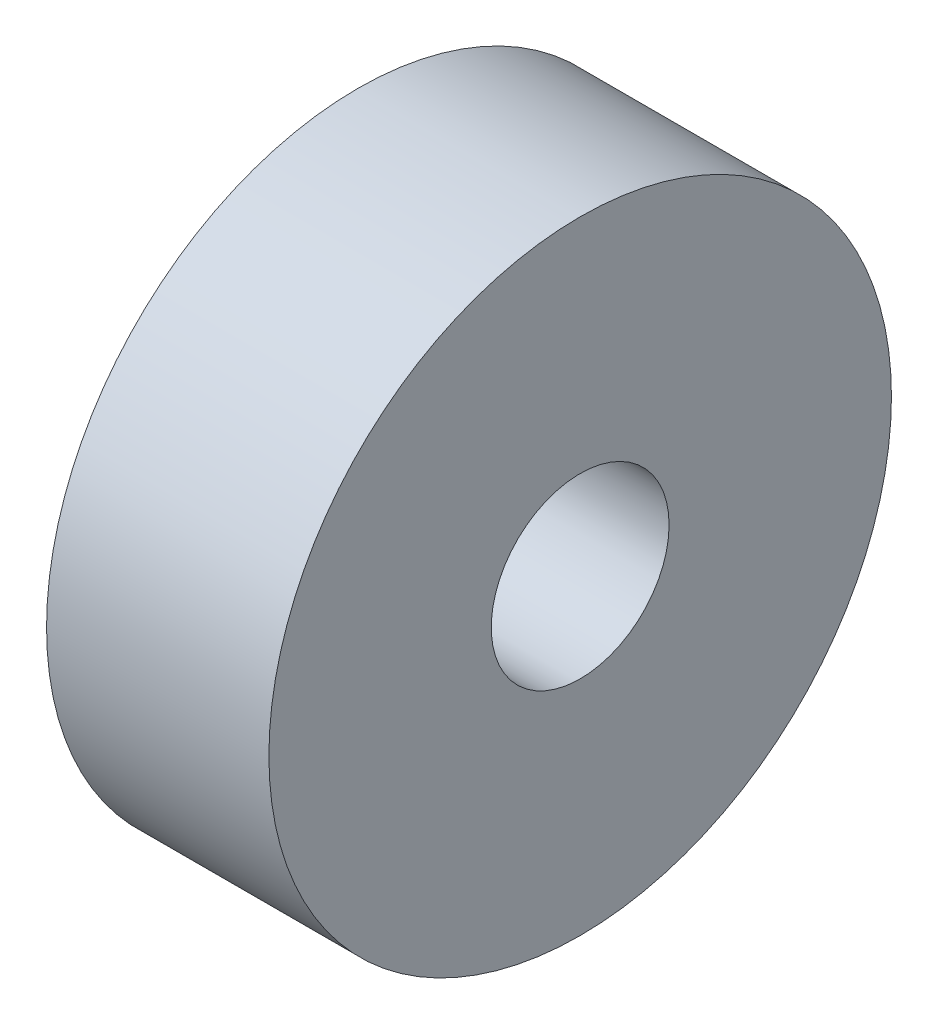
ISO-10303-21;
HEADER;
FILE_DESCRIPTION(('STEP AP214'),'2;1');
FILE_NAME('part.step','',(''),(''),'','','');
FILE_SCHEMA(('AUTOMOTIVE_DESIGN { 1 0 10303 214 1 1 1 1 }'));
ENDSEC;
DATA;
#1=APPLICATION_CONTEXT('core data for automotive mechanical design processes');
#2=APPLICATION_PROTOCOL_DEFINITION('international standard','automotive_design',2000,#1);
#3=PRODUCT_CONTEXT('',#1,'mechanical');
#4=PRODUCT('Part','Part','',(#3));
#5=PRODUCT_RELATED_PRODUCT_CATEGORY('part','',(#4));
#6=PRODUCT_DEFINITION_FORMATION('','',#4);
#7=PRODUCT_DEFINITION_CONTEXT('part definition',#1,'design');
#8=PRODUCT_DEFINITION('design','',#6,#7);
#9=PRODUCT_DEFINITION_SHAPE('','',#8);
#10=(LENGTH_UNIT() NAMED_UNIT(*) SI_UNIT(.MILLI.,.METRE.));
#11=(NAMED_UNIT(*) PLANE_ANGLE_UNIT() SI_UNIT($,.RADIAN.));
#12=(NAMED_UNIT(*) SI_UNIT($,.STERADIAN.) SOLID_ANGLE_UNIT());
#13=UNCERTAINTY_MEASURE_WITH_UNIT(LENGTH_MEASURE(1.E-05),#10,'distance_accuracy_value','');
#14=(GEOMETRIC_REPRESENTATION_CONTEXT(3) GLOBAL_UNCERTAINTY_ASSIGNED_CONTEXT((#13)) GLOBAL_UNIT_ASSIGNED_CONTEXT((#10,
#11,#12)) REPRESENTATION_CONTEXT('',''));
#15=CARTESIAN_POINT('',(0.,0.,0.));
#16=DIRECTION('',(0.,0.,1.));
#17=DIRECTION('',(1.,0.,0.));
#18=AXIS2_PLACEMENT_3D('',#15,#16,#17);
#19=CARTESIAN_POINT('',(10.,0.,0.));
#20=DIRECTION('',(1.,0.,0.));
#21=DIRECTION('',(0.,0.,-1.));
#22=AXIS2_PLACEMENT_3D('',#19,#20,#21);
#23=PLANE('',#22);
#24=CARTESIAN_POINT('',(10.,0.,0.));
#25=DIRECTION('',(1.,0.,0.));
#26=DIRECTION('',(0.,0.,-1.));
#27=AXIS2_PLACEMENT_3D('',#24,#25,#26);
#28=CIRCLE('',#27,14.);
#29=CARTESIAN_POINT('',(10.,0.,-14.));
#30=VERTEX_POINT('',#29);
#31=EDGE_CURVE('E10',#30,#30,#28,.T.);
#32=ORIENTED_EDGE('',*,*,#31,.T.);
#33=EDGE_LOOP('',(#32));
#34=FACE_BOUND('',#33,.T.);
#35=CARTESIAN_POINT('',(10.,0.,0.));
#36=DIRECTION('',(1.,0.,0.));
#37=DIRECTION('',(0.,0.,-1.));
#38=AXIS2_PLACEMENT_3D('',#35,#36,#37);
#39=CIRCLE('',#38,4.);
#40=CARTESIAN_POINT('',(10.,0.,-4.));
#41=VERTEX_POINT('',#40);
#42=EDGE_CURVE('E42',#41,#41,#39,.T.);
#43=ORIENTED_EDGE('',*,*,#42,.F.);
#44=EDGE_LOOP('',(#43));
#45=FACE_BOUND('',#44,.T.);
#46=ADVANCED_FACE('F31',(#34,#45),#23,.T.);
#47=CARTESIAN_POINT('',(0.,0.,0.));
#48=DIRECTION('',(1.,0.,0.));
#49=DIRECTION('',(0.,0.,-1.));
#50=AXIS2_PLACEMENT_3D('',#47,#48,#49);
#51=PLANE('',#50);
#52=CARTESIAN_POINT('',(0.,0.,0.));
#53=DIRECTION('',(1.,0.,0.));
#54=DIRECTION('',(0.,0.,-1.));
#55=AXIS2_PLACEMENT_3D('',#52,#53,#54);
#56=CIRCLE('',#55,14.);
#57=CARTESIAN_POINT('',(0.,0.,-14.));
#58=VERTEX_POINT('',#57);
#59=EDGE_CURVE('E35',#58,#58,#56,.T.);
#60=ORIENTED_EDGE('',*,*,#59,.F.);
#61=EDGE_LOOP('',(#60));
#62=FACE_BOUND('',#61,.T.);
#63=CARTESIAN_POINT('',(0.,0.,0.));
#64=DIRECTION('',(1.,0.,0.));
#65=DIRECTION('',(0.,0.,-1.));
#66=AXIS2_PLACEMENT_3D('',#63,#64,#65);
#67=CIRCLE('',#66,4.);
#68=CARTESIAN_POINT('',(0.,0.,-4.));
#69=VERTEX_POINT('',#68);
#70=EDGE_CURVE('E44',#69,#69,#67,.T.);
#71=ORIENTED_EDGE('',*,*,#70,.T.);
#72=EDGE_LOOP('',(#71));
#73=FACE_BOUND('',#72,.T.);
#74=ADVANCED_FACE('F54',(#62,#73),#51,.F.);
#75=CARTESIAN_POINT('',(10.,0.,0.));
#76=DIRECTION('',(-1.,0.,0.));
#77=DIRECTION('',(0.,0.,1.));
#78=AXIS2_PLACEMENT_3D('',#75,#76,#77);
#79=CYLINDRICAL_SURFACE('',#78,14.);
#80=ORIENTED_EDGE('',*,*,#31,.F.);
#81=EDGE_LOOP('',(#80));
#82=FACE_BOUND('',#81,.T.);
#83=ORIENTED_EDGE('',*,*,#59,.T.);
#84=EDGE_LOOP('',(#83));
#85=FACE_BOUND('',#84,.T.);
#86=ADVANCED_FACE('F33',(#82,#85),#79,.T.);
#87=CARTESIAN_POINT('',(10.,0.,0.));
#88=DIRECTION('',(-1.,0.,0.));
#89=DIRECTION('',(0.,0.,1.));
#90=AXIS2_PLACEMENT_3D('',#87,#88,#89);
#91=CYLINDRICAL_SURFACE('',#90,4.);
#92=ORIENTED_EDGE('',*,*,#42,.T.);
#93=EDGE_LOOP('',(#92));
#94=FACE_BOUND('',#93,.T.);
#95=ORIENTED_EDGE('',*,*,#70,.F.);
#96=EDGE_LOOP('',(#95));
#97=FACE_BOUND('',#96,.T.);
#98=ADVANCED_FACE('F50',(#94,#97),#91,.F.);
#99=CLOSED_SHELL('',(#46,#74,#86,#98));
#100=MANIFOLD_SOLID_BREP('B2',#99);
#101=ADVANCED_BREP_SHAPE_REPRESENTATION('',(#18,#100),#14);
#102=SHAPE_DEFINITION_REPRESENTATION(#9,#101);
ENDSEC;
END-ISO-10303-21;
